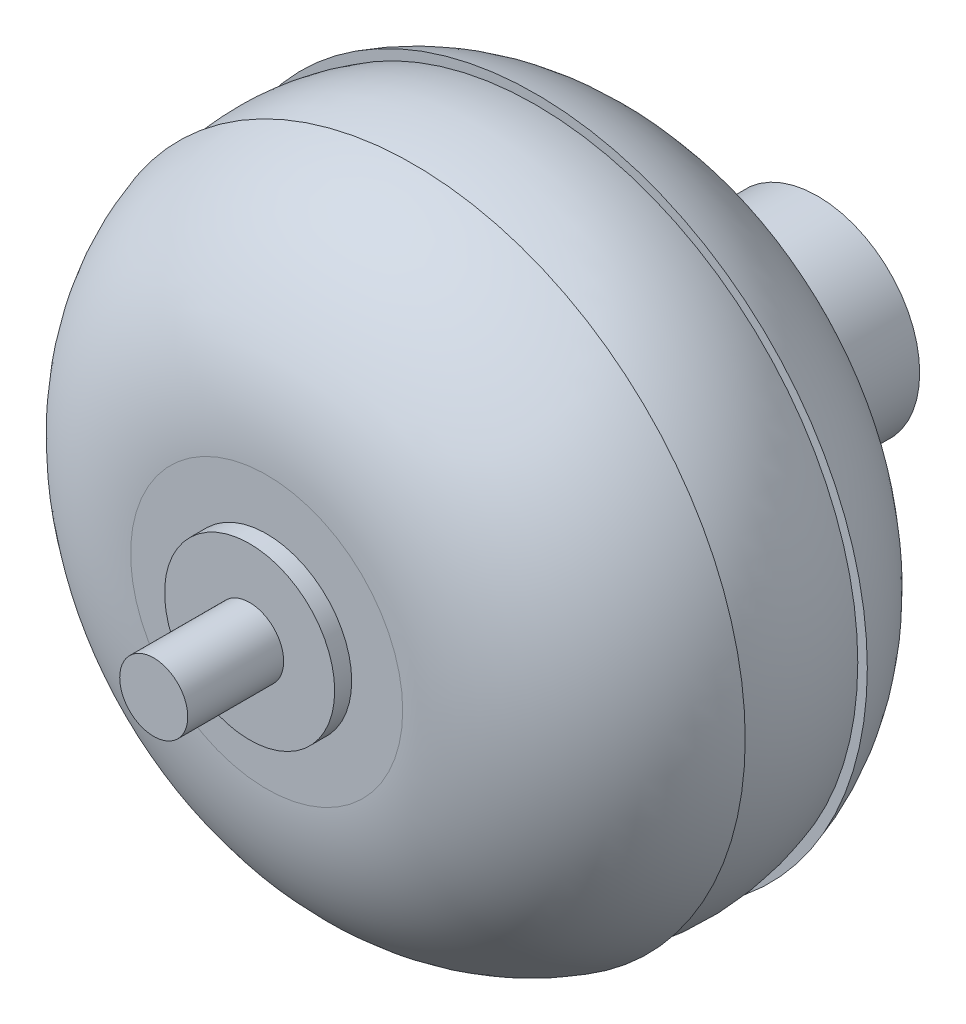
ISO-10303-21;
HEADER;
FILE_DESCRIPTION(('STEP AP214'),'2;1');
FILE_NAME('part.step','',(''),(''),'','','');
FILE_SCHEMA(('AUTOMOTIVE_DESIGN { 1 0 10303 214 1 1 1 1 }'));
ENDSEC;
DATA;
#1=APPLICATION_CONTEXT('core data for automotive mechanical design processes');
#2=APPLICATION_PROTOCOL_DEFINITION('international standard','automotive_design',2000,#1);
#3=PRODUCT_CONTEXT('',#1,'mechanical');
#4=PRODUCT('Part','Part','',(#3));
#5=PRODUCT_RELATED_PRODUCT_CATEGORY('part','',(#4));
#6=PRODUCT_DEFINITION_FORMATION('','',#4);
#7=PRODUCT_DEFINITION_CONTEXT('part definition',#1,'design');
#8=PRODUCT_DEFINITION('design','',#6,#7);
#9=PRODUCT_DEFINITION_SHAPE('','',#8);
#10=(LENGTH_UNIT() NAMED_UNIT(*) SI_UNIT(.MILLI.,.METRE.));
#11=(NAMED_UNIT(*) PLANE_ANGLE_UNIT() SI_UNIT($,.RADIAN.));
#12=(NAMED_UNIT(*) SI_UNIT($,.STERADIAN.) SOLID_ANGLE_UNIT());
#13=UNCERTAINTY_MEASURE_WITH_UNIT(LENGTH_MEASURE(1.E-05),#10,'distance_accuracy_value','');
#14=(GEOMETRIC_REPRESENTATION_CONTEXT(3) GLOBAL_UNCERTAINTY_ASSIGNED_CONTEXT((#13)) GLOBAL_UNIT_ASSIGNED_CONTEXT((#10,
#11,#12)) REPRESENTATION_CONTEXT('',''));
#15=CARTESIAN_POINT('',(0.,0.,0.));
#16=DIRECTION('',(0.,0.,1.));
#17=DIRECTION('',(1.,0.,0.));
#18=AXIS2_PLACEMENT_3D('',#15,#16,#17);
#19=CARTESIAN_POINT('',(0.,0.,6.2));
#20=DIRECTION('',(0.,0.,1.));
#21=DIRECTION('',(1.,0.,0.));
#22=AXIS2_PLACEMENT_3D('',#19,#20,#21);
#23=DEGENERATE_TOROIDAL_SURFACE('',#22,4.,6.,.T.);
#24=CARTESIAN_POINT('',(0.,0.,12.2));
#25=DIRECTION('',(0.,0.,1.));
#26=DIRECTION('',(1.,0.,0.));
#27=AXIS2_PLACEMENT_3D('',#24,#25,#26);
#28=CIRCLE('',#27,4.);
#29=CARTESIAN_POINT('',(4.,0.,12.2));
#30=VERTEX_POINT('',#29);
#31=EDGE_CURVE('E47',#30,#30,#28,.T.);
#32=ORIENTED_EDGE('',*,*,#31,.F.);
#33=EDGE_LOOP('',(#32));
#34=FACE_BOUND('',#33,.T.);
#35=CARTESIAN_POINT('',(0.,0.,7.88726295495752));
#36=DIRECTION('',(0.,0.,-1.));
#37=DIRECTION('',(-1.,0.,0.));
#38=AXIS2_PLACEMENT_3D('',#35,#36,#37);
#39=CIRCLE('',#38,9.75787666773334);
#40=CARTESIAN_POINT('',(-9.75787666773334,0.,7.88726295495752));
#41=VERTEX_POINT('',#40);
#42=EDGE_CURVE('E38',#41,#41,#39,.F.);
#43=ORIENTED_EDGE('',*,*,#42,.T.);
#44=EDGE_LOOP('',(#43));
#45=FACE_BOUND('',#44,.T.);
#46=ADVANCED_FACE('F34',(#34,#45),#23,.T.);
#47=CARTESIAN_POINT('',(0.,0.,12.2));
#48=DIRECTION('',(0.,0.,1.));
#49=DIRECTION('',(1.,0.,0.));
#50=AXIS2_PLACEMENT_3D('',#47,#48,#49);
#51=PLANE('',#50);
#52=ORIENTED_EDGE('',*,*,#31,.T.);
#53=EDGE_LOOP('',(#52));
#54=FACE_BOUND('',#53,.T.);
#55=CARTESIAN_POINT('',(0.,0.,12.2));
#56=DIRECTION('',(0.,0.,1.));
#57=DIRECTION('',(1.,0.,0.));
#58=AXIS2_PLACEMENT_3D('',#55,#56,#57);
#59=CIRCLE('',#58,2.5);
#60=CARTESIAN_POINT('',(2.5,0.,12.2));
#61=VERTEX_POINT('',#60);
#62=EDGE_CURVE('E80',#61,#61,#59,.T.);
#63=ORIENTED_EDGE('',*,*,#62,.F.);
#64=EDGE_LOOP('',(#63));
#65=FACE_BOUND('',#64,.T.);
#66=ADVANCED_FACE('F87',(#54,#65),#51,.T.);
#67=CARTESIAN_POINT('',(0.,0.,12.7));
#68=DIRECTION('',(0.,0.,-1.));
#69=DIRECTION('',(-1.,0.,0.));
#70=AXIS2_PLACEMENT_3D('',#67,#68,#69);
#71=CYLINDRICAL_SURFACE('',#70,2.5);
#72=CARTESIAN_POINT('',(0.,0.,12.7));
#73=DIRECTION('',(0.,0.,1.));
#74=DIRECTION('',(1.,0.,0.));
#75=AXIS2_PLACEMENT_3D('',#72,#73,#74);
#76=CIRCLE('',#75,2.5);
#77=CARTESIAN_POINT('',(2.5,0.,12.7));
#78=VERTEX_POINT('',#77);
#79=EDGE_CURVE('E77',#78,#78,#76,.T.);
#80=ORIENTED_EDGE('',*,*,#79,.F.);
#81=EDGE_LOOP('',(#80));
#82=FACE_BOUND('',#81,.T.);
#83=ORIENTED_EDGE('',*,*,#62,.T.);
#84=EDGE_LOOP('',(#83));
#85=FACE_BOUND('',#84,.T.);
#86=ADVANCED_FACE('F138',(#82,#85),#71,.T.);
#87=CARTESIAN_POINT('',(0.,0.,12.7));
#88=DIRECTION('',(0.,0.,1.));
#89=DIRECTION('',(1.,0.,0.));
#90=AXIS2_PLACEMENT_3D('',#87,#88,#89);
#91=PLANE('',#90);
#92=CARTESIAN_POINT('',(0.,0.,12.7));
#93=DIRECTION('',(0.,0.,1.));
#94=DIRECTION('',(1.,0.,0.));
#95=AXIS2_PLACEMENT_3D('',#92,#93,#94);
#96=CIRCLE('',#95,1.);
#97=CARTESIAN_POINT('',(-1.,0.,12.7));
#98=VERTEX_POINT('',#97);
#99=EDGE_CURVE('E76',#98,#98,#96,.F.);
#100=ORIENTED_EDGE('',*,*,#99,.T.);
#101=EDGE_LOOP('',(#100));
#102=FACE_BOUND('',#101,.T.);
#103=ORIENTED_EDGE('',*,*,#79,.T.);
#104=EDGE_LOOP('',(#103));
#105=FACE_BOUND('',#104,.T.);
#106=ADVANCED_FACE('F134',(#102,#105),#91,.T.);
#107=CARTESIAN_POINT('',(0.,0.,15.52));
#108=DIRECTION('',(0.,0.,-1.));
#109=DIRECTION('',(-1.,0.,0.));
#110=AXIS2_PLACEMENT_3D('',#107,#108,#109);
#111=CYLINDRICAL_SURFACE('',#110,1.);
#112=CARTESIAN_POINT('',(0.,0.,15.52));
#113=DIRECTION('',(0.,0.,1.));
#114=DIRECTION('',(1.,0.,0.));
#115=AXIS2_PLACEMENT_3D('',#112,#113,#114);
#116=CIRCLE('',#115,1.);
#117=CARTESIAN_POINT('',(-1.,0.,15.52));
#118=VERTEX_POINT('',#117);
#119=EDGE_CURVE('E73',#118,#118,#116,.T.);
#120=CARTESIAN_POINT('',(-1.,0.,12.7));
#121=CARTESIAN_POINT('',(-1.,0.,12.729375));
#122=CARTESIAN_POINT('',(-1.,0.,12.75875));
#123=CARTESIAN_POINT('',(-1.,0.,12.8175));
#124=CARTESIAN_POINT('',(-1.,0.,12.846875));
#125=CARTESIAN_POINT('',(-1.,0.,12.905625));
#126=CARTESIAN_POINT('',(-1.,0.,12.935));
#127=CARTESIAN_POINT('',(-1.,0.,12.99375));
#128=CARTESIAN_POINT('',(-1.,0.,13.023125));
#129=CARTESIAN_POINT('',(-1.,0.,13.081875));
#130=CARTESIAN_POINT('',(-1.,0.,13.11125));
#131=CARTESIAN_POINT('',(-1.,0.,13.17));
#132=CARTESIAN_POINT('',(-1.,0.,13.199375));
#133=CARTESIAN_POINT('',(-1.,0.,13.258125));
#134=CARTESIAN_POINT('',(-1.,0.,13.2875));
#135=CARTESIAN_POINT('',(-1.,0.,13.34625));
#136=CARTESIAN_POINT('',(-1.,0.,13.375625));
#137=CARTESIAN_POINT('',(-1.,0.,13.434375));
#138=CARTESIAN_POINT('',(-1.,0.,13.46375));
#139=CARTESIAN_POINT('',(-1.,0.,13.5225));
#140=CARTESIAN_POINT('',(-1.,0.,13.551875));
#141=CARTESIAN_POINT('',(-1.,0.,13.610625));
#142=CARTESIAN_POINT('',(-1.,0.,13.64));
#143=CARTESIAN_POINT('',(-1.,0.,13.69875));
#144=CARTESIAN_POINT('',(-1.,0.,13.728125));
#145=CARTESIAN_POINT('',(-1.,0.,13.786875));
#146=CARTESIAN_POINT('',(-1.,0.,13.81625));
#147=CARTESIAN_POINT('',(-1.,0.,13.875));
#148=CARTESIAN_POINT('',(-1.,0.,13.904375));
#149=CARTESIAN_POINT('',(-1.,0.,13.963125));
#150=CARTESIAN_POINT('',(-1.,0.,13.9925));
#151=CARTESIAN_POINT('',(-1.,0.,14.05125));
#152=CARTESIAN_POINT('',(-1.,0.,14.080625));
#153=CARTESIAN_POINT('',(-1.,0.,14.139375));
#154=CARTESIAN_POINT('',(-1.,0.,14.16875));
#155=CARTESIAN_POINT('',(-1.,0.,14.2275));
#156=CARTESIAN_POINT('',(-1.,0.,14.256875));
#157=CARTESIAN_POINT('',(-1.,0.,14.315625));
#158=CARTESIAN_POINT('',(-1.,0.,14.345));
#159=CARTESIAN_POINT('',(-1.,0.,14.40375));
#160=CARTESIAN_POINT('',(-1.,0.,14.433125));
#161=CARTESIAN_POINT('',(-1.,0.,14.491875));
#162=CARTESIAN_POINT('',(-1.,0.,14.52125));
#163=CARTESIAN_POINT('',(-1.,0.,14.58));
#164=CARTESIAN_POINT('',(-1.,0.,14.609375));
#165=CARTESIAN_POINT('',(-1.,0.,14.668125));
#166=CARTESIAN_POINT('',(-1.,0.,14.6975));
#167=CARTESIAN_POINT('',(-1.,0.,14.75625));
#168=CARTESIAN_POINT('',(-1.,0.,14.785625));
#169=CARTESIAN_POINT('',(-1.,0.,14.844375));
#170=CARTESIAN_POINT('',(-1.,0.,14.87375));
#171=CARTESIAN_POINT('',(-1.,0.,14.9325));
#172=CARTESIAN_POINT('',(-1.,0.,14.961875));
#173=CARTESIAN_POINT('',(-1.,0.,15.020625));
#174=CARTESIAN_POINT('',(-1.,0.,15.05));
#175=CARTESIAN_POINT('',(-1.,0.,15.10875));
#176=CARTESIAN_POINT('',(-1.,0.,15.138125));
#177=CARTESIAN_POINT('',(-1.,0.,15.196875));
#178=CARTESIAN_POINT('',(-1.,0.,15.22625));
#179=CARTESIAN_POINT('',(-1.,0.,15.285));
#180=CARTESIAN_POINT('',(-1.,0.,15.314375));
#181=CARTESIAN_POINT('',(-1.,0.,15.373125));
#182=CARTESIAN_POINT('',(-1.,0.,15.4025));
#183=CARTESIAN_POINT('',(-1.,0.,15.46125));
#184=CARTESIAN_POINT('',(-1.,0.,15.490625));
#185=CARTESIAN_POINT('',(-1.,0.,15.52));
#186=B_SPLINE_CURVE_WITH_KNOTS('',3,(#120,#121,#122,#123,#124,#125,#126,#127,#128,#129,#130,
#131,#132,#133,#134,#135,#136,#137,#138,#139,#140,#141,#142,#143,#144,#145,#146,#147,#148,#149,
#150,#151,#152,#153,#154,#155,#156,#157,#158,#159,#160,#161,#162,#163,#164,#165,#166,#167,#168,
#169,#170,#171,#172,#173,#174,#175,#176,#177,#178,#179,#180,#181,#182,#183,#184,#185),
.UNSPECIFIED.,.F.,.F.,(4,2,2,2,2,2,2,2,2,2,2,2,2,2,2,2,2,2,2,2,2,2,2,2,2,2,2,2,2,2,2,2,4),(0.,
0.0881249999999997,0.176250000000001,0.264375000000001,0.3525,0.440625,0.52875,
0.616875000000001,0.705000000000001,0.793125,0.88125,0.969375,1.0575,1.145625,1.23375,1.321875,
1.41,1.498125,1.58625,1.674375,1.7625,1.850625,1.93875,2.026875,2.115,2.203125,2.29125,2.379375,
2.4675,2.555625,2.64375,2.731875,2.82),.UNSPECIFIED.);
#187=EDGE_CURVE('BSEAM130',#98,#118,#186,.T.);
#188=ORIENTED_EDGE('',*,*,#99,.F.);
#189=ORIENTED_EDGE('',*,*,#119,.F.);
#190=ORIENTED_EDGE('',*,*,#187,.T.);
#191=ORIENTED_EDGE('',*,*,#187,.F.);
#192=EDGE_LOOP('',(#188,#190,#189,#191));
#193=FACE_BOUND('',#192,.T.);
#194=ADVANCED_FACE('F130',(#193),#111,.T.);
#195=CARTESIAN_POINT('',(0.,0.,15.52));
#196=DIRECTION('',(0.,0.,1.));
#197=DIRECTION('',(1.,0.,0.));
#198=AXIS2_PLACEMENT_3D('',#195,#196,#197);
#199=PLANE('',#198);
#200=ORIENTED_EDGE('',*,*,#119,.T.);
#201=EDGE_LOOP('',(#200));
#202=FACE_BOUND('',#201,.T.);
#203=ADVANCED_FACE('F98',(#202),#199,.T.);
#204=CARTESIAN_POINT('',(0.,10.5991008266728,7.88726295495752));
#205=DIRECTION('',(0.,0.,-1.));
#206=DIRECTION('',(-1.,0.,0.));
#207=AXIS2_PLACEMENT_3D('',#204,#205,#206);
#208=PLANE('',#207);
#209=ORIENTED_EDGE('',*,*,#42,.F.);
#210=EDGE_LOOP('',(#209));
#211=FACE_BOUND('',#210,.T.);
#212=CARTESIAN_POINT('',(0.,0.,7.88726295495752));
#213=DIRECTION('',(0.,0.,1.));
#214=DIRECTION('',(1.,0.,0.));
#215=AXIS2_PLACEMENT_3D('',#212,#213,#214);
#216=CIRCLE('',#215,9.47120705648134);
#217=CARTESIAN_POINT('',(9.47120705648134,0.,7.88726295495752));
#218=VERTEX_POINT('',#217);
#219=EDGE_CURVE('E58',#218,#218,#216,.T.);
#220=ORIENTED_EDGE('',*,*,#219,.T.);
#221=EDGE_LOOP('',(#220));
#222=FACE_BOUND('',#221,.T.);
#223=ADVANCED_FACE('F94',(#211,#222),#208,.T.);
#224=CARTESIAN_POINT('',(0.,10.5991008266728,4.29107991956434));
#225=DIRECTION('',(0.,0.,1.));
#226=DIRECTION('',(1.,0.,0.));
#227=AXIS2_PLACEMENT_3D('',#224,#225,#226);
#228=PLANE('',#227);
#229=CARTESIAN_POINT('',(0.,0.,4.29107991956434));
#230=DIRECTION('',(0.,0.,1.));
#231=DIRECTION('',(1.,0.,0.));
#232=AXIS2_PLACEMENT_3D('',#229,#230,#231);
#233=CIRCLE('',#232,9.75148608262976);
#234=CARTESIAN_POINT('',(9.75148608262976,0.,4.29107991956434));
#235=VERTEX_POINT('',#234);
#236=EDGE_CURVE('E50',#235,#235,#233,.F.);
#237=ORIENTED_EDGE('',*,*,#236,.F.);
#238=EDGE_LOOP('',(#237));
#239=FACE_BOUND('',#238,.T.);
#240=CARTESIAN_POINT('',(0.,0.,4.29107991956434));
#241=DIRECTION('',(0.,0.,1.));
#242=DIRECTION('',(1.,0.,0.));
#243=AXIS2_PLACEMENT_3D('',#240,#241,#242);
#244=CIRCLE('',#243,9.47120705648134);
#245=CARTESIAN_POINT('',(9.47120705648134,0.,4.29107991956434));
#246=VERTEX_POINT('',#245);
#247=EDGE_CURVE('E52',#246,#246,#244,.T.);
#248=ORIENTED_EDGE('',*,*,#247,.F.);
#249=EDGE_LOOP('',(#248));
#250=FACE_BOUND('',#249,.T.);
#251=ADVANCED_FACE('F97',(#239,#250),#228,.T.);
#252=CARTESIAN_POINT('',(0.,0.,6.08917143726093));
#253=DIRECTION('',(0.,0.,1.));
#254=DIRECTION('',(1.,0.,0.));
#255=AXIS2_PLACEMENT_3D('',#252,#253,#254);
#256=DEGENERATE_TOROIDAL_SURFACE('',#255,3.97488873425487,5.78296188862203,.T.);
#257=ORIENTED_EDGE('',*,*,#247,.T.);
#258=EDGE_LOOP('',(#257));
#259=FACE_BOUND('',#258,.T.);
#260=ORIENTED_EDGE('',*,*,#219,.F.);
#261=EDGE_LOOP('',(#260));
#262=FACE_BOUND('',#261,.T.);
#263=ADVANCED_FACE('F102',(#259,#262),#256,.T.);
#264=CARTESIAN_POINT('',(0.,0.,-1.45));
#265=DIRECTION('',(0.,0.,-1.));
#266=DIRECTION('',(-1.,0.,0.));
#267=AXIS2_PLACEMENT_3D('',#264,#265,#266);
#268=PLANE('',#267);
#269=CARTESIAN_POINT('',(0.,0.,-1.45));
#270=DIRECTION('',(0.,0.,-1.));
#271=DIRECTION('',(-1.,0.,0.));
#272=AXIS2_PLACEMENT_3D('',#269,#270,#271);
#273=CIRCLE('',#272,2.25);
#274=CARTESIAN_POINT('',(-2.25,0.,-1.45));
#275=VERTEX_POINT('',#274);
#276=EDGE_CURVE('E65',#275,#275,#273,.T.);
#277=ORIENTED_EDGE('',*,*,#276,.T.);
#278=EDGE_LOOP('',(#277));
#279=FACE_BOUND('',#278,.T.);
#280=ADVANCED_FACE('F104',(#279),#268,.T.);
#281=CARTESIAN_POINT('',(0.,0.,-1.45));
#282=DIRECTION('',(0.,0.,-1.));
#283=DIRECTION('',(-1.,0.,0.));
#284=AXIS2_PLACEMENT_3D('',#281,#282,#283);
#285=CYLINDRICAL_SURFACE('',#284,2.25);
#286=ORIENTED_EDGE('',*,*,#276,.F.);
#287=EDGE_LOOP('',(#286));
#288=FACE_BOUND('',#287,.T.);
#289=CARTESIAN_POINT('',(0.,0.,-4.));
#290=DIRECTION('',(0.,0.,-1.));
#291=DIRECTION('',(-1.,0.,0.));
#292=AXIS2_PLACEMENT_3D('',#289,#290,#291);
#293=CIRCLE('',#292,2.25);
#294=CARTESIAN_POINT('',(-2.25,0.,-4.));
#295=VERTEX_POINT('',#294);
#296=EDGE_CURVE('E56',#295,#295,#293,.T.);
#297=ORIENTED_EDGE('',*,*,#296,.T.);
#298=EDGE_LOOP('',(#297));
#299=FACE_BOUND('',#298,.T.);
#300=ADVANCED_FACE('F110',(#288,#299),#285,.F.);
#301=CARTESIAN_POINT('',(0.,0.,-4.));
#302=DIRECTION('',(0.,0.,-1.));
#303=DIRECTION('',(-1.,0.,0.));
#304=AXIS2_PLACEMENT_3D('',#301,#302,#303);
#305=PLANE('',#304);
#306=ORIENTED_EDGE('',*,*,#296,.F.);
#307=EDGE_LOOP('',(#306));
#308=FACE_BOUND('',#307,.T.);
#309=CARTESIAN_POINT('',(0.,0.,-4.));
#310=DIRECTION('',(0.,0.,-1.));
#311=DIRECTION('',(-1.,0.,0.));
#312=AXIS2_PLACEMENT_3D('',#309,#310,#311);
#313=CIRCLE('',#312,3.);
#314=CARTESIAN_POINT('',(-3.,0.,-4.));
#315=VERTEX_POINT('',#314);
#316=EDGE_CURVE('E68',#315,#315,#313,.T.);
#317=ORIENTED_EDGE('',*,*,#316,.T.);
#318=EDGE_LOOP('',(#317));
#319=FACE_BOUND('',#318,.T.);
#320=ADVANCED_FACE('F118',(#308,#319),#305,.T.);
#321=CARTESIAN_POINT('',(0.,0.,-4.));
#322=DIRECTION('',(0.,0.,1.));
#323=DIRECTION('',(1.,0.,0.));
#324=AXIS2_PLACEMENT_3D('',#321,#322,#323);
#325=CYLINDRICAL_SURFACE('',#324,3.);
#326=ORIENTED_EDGE('',*,*,#316,.F.);
#327=EDGE_LOOP('',(#326));
#328=FACE_BOUND('',#327,.T.);
#329=CARTESIAN_POINT('',(0.,0.,0.));
#330=DIRECTION('',(0.,0.,1.));
#331=DIRECTION('',(1.,0.,0.));
#332=AXIS2_PLACEMENT_3D('',#329,#330,#331);
#333=CIRCLE('',#332,3.);
#334=CARTESIAN_POINT('',(3.,0.,0.));
#335=VERTEX_POINT('',#334);
#336=EDGE_CURVE('E10',#335,#335,#333,.F.);
#337=ORIENTED_EDGE('',*,*,#336,.T.);
#338=EDGE_LOOP('',(#337));
#339=FACE_BOUND('',#338,.T.);
#340=ADVANCED_FACE('F122',(#328,#339),#325,.T.);
#341=CARTESIAN_POINT('',(0.,0.,0.));
#342=DIRECTION('',(0.,0.,1.));
#343=DIRECTION('',(1.,0.,0.));
#344=AXIS2_PLACEMENT_3D('',#341,#342,#343);
#345=PLANE('',#344);
#346=ORIENTED_EDGE('',*,*,#336,.F.);
#347=EDGE_LOOP('',(#346));
#348=FACE_BOUND('',#347,.T.);
#349=CARTESIAN_POINT('',(0.,0.,0.));
#350=DIRECTION('',(0.,0.,1.));
#351=DIRECTION('',(1.,0.,0.));
#352=AXIS2_PLACEMENT_3D('',#349,#350,#351);
#353=CIRCLE('',#352,4.);
#354=CARTESIAN_POINT('',(4.,0.,0.));
#355=VERTEX_POINT('',#354);
#356=EDGE_CURVE('E42',#355,#355,#353,.F.);
#357=ORIENTED_EDGE('',*,*,#356,.T.);
#358=EDGE_LOOP('',(#357));
#359=FACE_BOUND('',#358,.T.);
#360=ADVANCED_FACE('F126',(#348,#359),#345,.F.);
#361=CARTESIAN_POINT('',(0.,0.,6.));
#362=DIRECTION('',(0.,0.,1.));
#363=DIRECTION('',(1.,0.,0.));
#364=AXIS2_PLACEMENT_3D('',#361,#362,#363);
#365=DEGENERATE_TOROIDAL_SURFACE('',#364,4.,6.,.T.);
#366=ORIENTED_EDGE('',*,*,#356,.F.);
#367=EDGE_LOOP('',(#366));
#368=FACE_BOUND('',#367,.T.);
#369=ORIENTED_EDGE('',*,*,#236,.T.);
#370=EDGE_LOOP('',(#369));
#371=FACE_BOUND('',#370,.T.);
#372=ADVANCED_FACE('F36',(#368,#371),#365,.T.);
#373=CLOSED_SHELL('',(#46,#66,#86,#106,#194,#203,#223,#251,#263,#280,#300,#320,#340,#360,#372));
#374=MANIFOLD_SOLID_BREP('B2',#373);
#375=ADVANCED_BREP_SHAPE_REPRESENTATION('',(#18,#374),#14);
#376=SHAPE_DEFINITION_REPRESENTATION(#9,#375);
ENDSEC;
END-ISO-10303-21;
